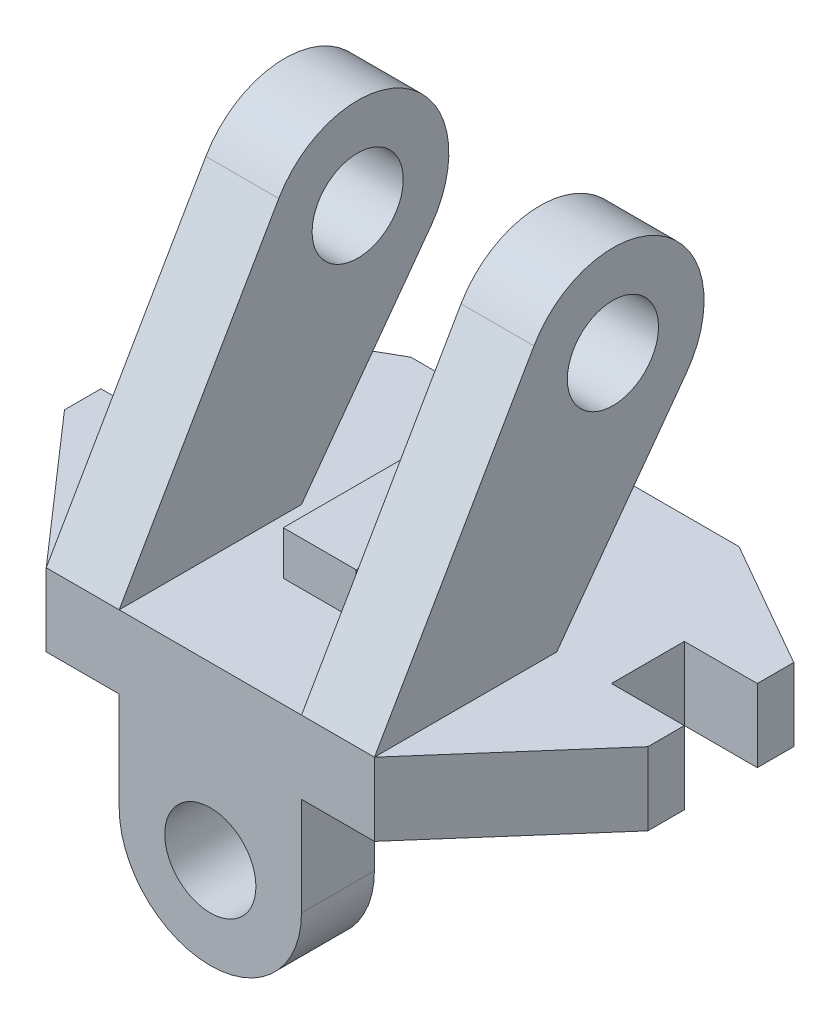
ISO-10303-21;
HEADER;
FILE_DESCRIPTION(('STEP AP214'),'2;1');
FILE_NAME('part.step','',(''),(''),'','','');
FILE_SCHEMA(('AUTOMOTIVE_DESIGN { 1 0 10303 214 1 1 1 1 }'));
ENDSEC;
DATA;
#1=APPLICATION_CONTEXT('core data for automotive mechanical design processes');
#2=APPLICATION_PROTOCOL_DEFINITION('international standard','automotive_design',2000,#1);
#3=PRODUCT_CONTEXT('',#1,'mechanical');
#4=PRODUCT('Part','Part','',(#3));
#5=PRODUCT_RELATED_PRODUCT_CATEGORY('part','',(#4));
#6=PRODUCT_DEFINITION_FORMATION('','',#4);
#7=PRODUCT_DEFINITION_CONTEXT('part definition',#1,'design');
#8=PRODUCT_DEFINITION('design','',#6,#7);
#9=PRODUCT_DEFINITION_SHAPE('','',#8);
#10=(LENGTH_UNIT() NAMED_UNIT(*) SI_UNIT(.MILLI.,.METRE.));
#11=(NAMED_UNIT(*) PLANE_ANGLE_UNIT() SI_UNIT($,.RADIAN.));
#12=(NAMED_UNIT(*) SI_UNIT($,.STERADIAN.) SOLID_ANGLE_UNIT());
#13=UNCERTAINTY_MEASURE_WITH_UNIT(LENGTH_MEASURE(1.E-05),#10,'distance_accuracy_value','');
#14=(GEOMETRIC_REPRESENTATION_CONTEXT(3) GLOBAL_UNCERTAINTY_ASSIGNED_CONTEXT((#13)) GLOBAL_UNIT_ASSIGNED_CONTEXT((#10,
#11,#12)) REPRESENTATION_CONTEXT('',''));
#15=CARTESIAN_POINT('',(0.,0.,0.));
#16=DIRECTION('',(0.,0.,1.));
#17=DIRECTION('',(1.,0.,0.));
#18=AXIS2_PLACEMENT_3D('',#15,#16,#17);
#19=CARTESIAN_POINT('',(0.,20.,-100.));
#20=DIRECTION('',(0.,-1.,0.));
#21=DIRECTION('',(0.,0.,-1.));
#22=AXIS2_PLACEMENT_3D('',#19,#20,#21);
#23=PLANE('',#22);
#24=DIRECTION('',(0.,0.,1.));
#25=VECTOR('',#24,1.);
#26=CARTESIAN_POINT('',(0.,20.,-100.));
#27=LINE('',#26,#25);
#28=CARTESIAN_POINT('',(0.,20.,-50.));
#29=VERTEX_POINT('',#28);
#30=CARTESIAN_POINT('',(0.,20.,-40.));
#31=VERTEX_POINT('',#30);
#32=EDGE_CURVE('E299',#29,#31,#27,.T.);
#33=ORIENTED_EDGE('',*,*,#32,.T.);
#34=DIRECTION('',(0.658504607868518,0.,0.752576694706878));
#35=VECTOR('',#34,1.);
#36=CARTESIAN_POINT('',(-29.7345132743363,20.,-73.9823008849558));
#37=LINE('',#36,#35);
#38=CARTESIAN_POINT('',(35.,20.,0.));
#39=VERTEX_POINT('',#38);
#40=EDGE_CURVE('E362',#31,#39,#37,.T.);
#41=ORIENTED_EDGE('',*,*,#40,.T.);
#42=DIRECTION('',(0.,0.,-1.));
#43=VECTOR('',#42,1.);
#44=CARTESIAN_POINT('',(35.,20.,0.));
#45=LINE('',#44,#43);
#46=CARTESIAN_POINT('',(35.,20.,-50.));
#47=VERTEX_POINT('',#46);
#48=EDGE_CURVE('E474',#39,#47,#45,.T.);
#49=ORIENTED_EDGE('',*,*,#48,.T.);
#50=DIRECTION('',(1.,0.,0.));
#51=VECTOR('',#50,1.);
#52=CARTESIAN_POINT('',(35.,20.,-50.));
#53=LINE('',#52,#51);
#54=CARTESIAN_POINT('',(55.,20.,-50.));
#55=VERTEX_POINT('',#54);
#56=EDGE_CURVE('E499',#47,#55,#53,.T.);
#57=ORIENTED_EDGE('',*,*,#56,.T.);
#58=DIRECTION('',(0.,0.,-1.));
#59=VECTOR('',#58,1.);
#60=CARTESIAN_POINT('',(55.,20.,0.));
#61=LINE('',#60,#59);
#62=CARTESIAN_POINT('',(55.,20.,0.));
#63=VERTEX_POINT('',#62);
#64=EDGE_CURVE('E462',#63,#55,#61,.T.);
#65=ORIENTED_EDGE('',*,*,#64,.F.);
#66=DIRECTION('',(1.,0.,0.));
#67=VECTOR('',#66,1.);
#68=CARTESIAN_POINT('',(0.,20.,0.));
#69=LINE('',#68,#67);
#70=CARTESIAN_POINT('',(105.,20.,0.));
#71=VERTEX_POINT('',#70);
#72=EDGE_CURVE('E274',#63,#71,#69,.T.);
#73=ORIENTED_EDGE('',*,*,#72,.T.);
#74=DIRECTION('',(0.,0.,-1.));
#75=VECTOR('',#74,1.);
#76=CARTESIAN_POINT('',(105.,20.,0.));
#77=LINE('',#76,#75);
#78=CARTESIAN_POINT('',(105.,20.,-50.));
#79=VERTEX_POINT('',#78);
#80=EDGE_CURVE('E410',#71,#79,#77,.T.);
#81=ORIENTED_EDGE('',*,*,#80,.T.);
#82=DIRECTION('',(-1.,0.,0.));
#83=VECTOR('',#82,1.);
#84=CARTESIAN_POINT('',(125.,20.,-50.));
#85=LINE('',#84,#83);
#86=CARTESIAN_POINT('',(125.,20.,-50.));
#87=VERTEX_POINT('',#86);
#88=EDGE_CURVE('E448',#87,#79,#85,.T.);
#89=ORIENTED_EDGE('',*,*,#88,.F.);
#90=DIRECTION('',(0.,0.,-1.));
#91=VECTOR('',#90,1.);
#92=CARTESIAN_POINT('',(125.,20.,0.));
#93=LINE('',#92,#91);
#94=CARTESIAN_POINT('',(125.,20.,0.));
#95=VERTEX_POINT('',#94);
#96=EDGE_CURVE('E422',#95,#87,#93,.T.);
#97=ORIENTED_EDGE('',*,*,#96,.F.);
#98=DIRECTION('',(-0.658504607868518,0.,0.752576694706878));
#99=VECTOR('',#98,1.);
#100=CARTESIAN_POINT('',(120.353982300885,20.,5.30973451327435));
#101=LINE('',#100,#99);
#102=CARTESIAN_POINT('',(160.,20.,-40.));
#103=VERTEX_POINT('',#102);
#104=EDGE_CURVE('E245',#103,#95,#101,.T.);
#105=ORIENTED_EDGE('',*,*,#104,.F.);
#106=DIRECTION('',(0.,0.,1.));
#107=VECTOR('',#106,1.);
#108=CARTESIAN_POINT('',(160.,20.,-100.));
#109=LINE('',#108,#107);
#110=CARTESIAN_POINT('',(160.,20.,-50.));
#111=VERTEX_POINT('',#110);
#112=EDGE_CURVE('E285',#111,#103,#109,.T.);
#113=ORIENTED_EDGE('',*,*,#112,.F.);
#114=DIRECTION('',(1.,0.,0.));
#115=VECTOR('',#114,1.);
#116=CARTESIAN_POINT('',(0.,20.,-50.));
#117=LINE('',#116,#115);
#118=CARTESIAN_POINT('',(140.,20.,-50.));
#119=VERTEX_POINT('',#118);
#120=EDGE_CURVE('E401',#119,#111,#117,.T.);
#121=ORIENTED_EDGE('',*,*,#120,.F.);
#122=DIRECTION('',(0.,0.,1.));
#123=VECTOR('',#122,1.);
#124=CARTESIAN_POINT('',(140.,20.,-100.));
#125=LINE('',#124,#123);
#126=CARTESIAN_POINT('',(140.,20.,-70.));
#127=VERTEX_POINT('',#126);
#128=EDGE_CURVE('E334',#127,#119,#125,.T.);
#129=ORIENTED_EDGE('',*,*,#128,.F.);
#130=DIRECTION('',(-1.,0.,0.));
#131=VECTOR('',#130,1.);
#132=CARTESIAN_POINT('',(0.,20.,-70.));
#133=LINE('',#132,#131);
#134=CARTESIAN_POINT('',(160.,20.,-70.));
#135=VERTEX_POINT('',#134);
#136=EDGE_CURVE('E396',#135,#127,#133,.T.);
#137=ORIENTED_EDGE('',*,*,#136,.F.);
#138=CARTESIAN_POINT('',(160.,20.,-80.));
#139=VERTEX_POINT('',#138);
#140=EDGE_CURVE('E289',#139,#135,#109,.T.);
#141=ORIENTED_EDGE('',*,*,#140,.F.);
#142=DIRECTION('',(0.868243142124459,0.,0.496138938356834));
#143=VECTOR('',#142,1.);
#144=CARTESIAN_POINT('',(30.7692307692308,20.,-153.846153846154));
#145=LINE('',#144,#143);
#146=CARTESIAN_POINT('',(125.,20.,-100.));
#147=VERTEX_POINT('',#146);
#148=EDGE_CURVE('E377',#147,#139,#145,.T.);
#149=ORIENTED_EDGE('',*,*,#148,.F.);
#150=DIRECTION('',(1.,0.,0.));
#151=VECTOR('',#150,1.);
#152=CARTESIAN_POINT('',(0.,20.,-100.));
#153=LINE('',#152,#151);
#154=CARTESIAN_POINT('',(90.,20.,-100.));
#155=VERTEX_POINT('',#154);
#156=EDGE_CURVE('E279',#155,#147,#153,.T.);
#157=ORIENTED_EDGE('',*,*,#156,.F.);
#158=DIRECTION('',(0.,0.,-1.));
#159=VECTOR('',#158,1.);
#160=CARTESIAN_POINT('',(90.,20.,-30.));
#161=LINE('',#160,#159);
#162=CARTESIAN_POINT('',(90.,20.,-30.));
#163=VERTEX_POINT('',#162);
#164=EDGE_CURVE('E545',#163,#155,#161,.T.);
#165=ORIENTED_EDGE('',*,*,#164,.F.);
#166=DIRECTION('',(1.,0.,0.));
#167=VECTOR('',#166,1.);
#168=CARTESIAN_POINT('',(0.,20.,-30.));
#169=LINE('',#168,#167);
#170=CARTESIAN_POINT('',(70.,20.,-30.));
#171=VERTEX_POINT('',#170);
#172=EDGE_CURVE('E510',#171,#163,#169,.T.);
#173=ORIENTED_EDGE('',*,*,#172,.F.);
#174=DIRECTION('',(0.,0.,-1.));
#175=VECTOR('',#174,1.);
#176=CARTESIAN_POINT('',(70.,20.,-30.));
#177=LINE('',#176,#175);
#178=CARTESIAN_POINT('',(70.,20.,-100.));
#179=VERTEX_POINT('',#178);
#180=EDGE_CURVE('E525',#171,#179,#177,.T.);
#181=ORIENTED_EDGE('',*,*,#180,.T.);
#182=CARTESIAN_POINT('',(35.,20.,-100.));
#183=VERTEX_POINT('',#182);
#184=EDGE_CURVE('E592',#183,#179,#153,.T.);
#185=ORIENTED_EDGE('',*,*,#184,.F.);
#186=DIRECTION('',(-0.868243142124459,0.,0.496138938356834));
#187=VECTOR('',#186,1.);
#188=CARTESIAN_POINT('',(8.61538461538461,20.,-84.9230769230769));
#189=LINE('',#188,#187);
#190=CARTESIAN_POINT('',(0.,20.,-80.));
#191=VERTEX_POINT('',#190);
#192=EDGE_CURVE('E369',#183,#191,#189,.T.);
#193=ORIENTED_EDGE('',*,*,#192,.T.);
#194=CARTESIAN_POINT('',(0.,20.,-70.));
#195=VERTEX_POINT('',#194);
#196=EDGE_CURVE('E298',#191,#195,#27,.T.);
#197=ORIENTED_EDGE('',*,*,#196,.T.);
#198=DIRECTION('',(1.,0.,0.));
#199=VECTOR('',#198,1.);
#200=CARTESIAN_POINT('',(0.,20.,-70.));
#201=LINE('',#200,#199);
#202=CARTESIAN_POINT('',(20.,20.,-70.));
#203=VERTEX_POINT('',#202);
#204=EDGE_CURVE('E59',#195,#203,#201,.T.);
#205=ORIENTED_EDGE('',*,*,#204,.T.);
#206=DIRECTION('',(0.,0.,1.));
#207=VECTOR('',#206,1.);
#208=CARTESIAN_POINT('',(20.,20.,-100.));
#209=LINE('',#208,#207);
#210=CARTESIAN_POINT('',(20.,20.,-50.));
#211=VERTEX_POINT('',#210);
#212=EDGE_CURVE('E392',#203,#211,#209,.T.);
#213=ORIENTED_EDGE('',*,*,#212,.T.);
#214=DIRECTION('',(-1.,0.,0.));
#215=VECTOR('',#214,1.);
#216=CARTESIAN_POINT('',(0.,20.,-50.));
#217=LINE('',#216,#215);
#218=EDGE_CURVE('E388',#211,#29,#217,.T.);
#219=ORIENTED_EDGE('',*,*,#218,.T.);
#220=EDGE_LOOP('',(#33,#41,#49,#57,#65,#73,#81,#89,#97,#105,#113,#121,#129,#137,#141,#149,#157,
#165,#173,#181,#185,#193,#197,#205,#213,#219));
#221=FACE_BOUND('',#220,.T.);
#222=ADVANCED_FACE('F36',(#221),#23,.F.);
#223=CARTESIAN_POINT('',(160.,0.,-100.));
#224=DIRECTION('',(1.,0.,0.));
#225=DIRECTION('',(0.,0.,-1.));
#226=AXIS2_PLACEMENT_3D('',#223,#224,#225);
#227=PLANE('',#226);
#228=ORIENTED_EDGE('',*,*,#112,.T.);
#229=DIRECTION('',(0.,1.,0.));
#230=VECTOR('',#229,1.);
#231=CARTESIAN_POINT('',(160.,-52.,-40.));
#232=LINE('',#231,#230);
#233=CARTESIAN_POINT('',(160.,0.,-40.));
#234=VERTEX_POINT('',#233);
#235=EDGE_CURVE('E250',#234,#103,#232,.T.);
#236=ORIENTED_EDGE('',*,*,#235,.F.);
#237=DIRECTION('',(0.,0.,1.));
#238=VECTOR('',#237,1.);
#239=CARTESIAN_POINT('',(160.,0.,-100.));
#240=LINE('',#239,#238);
#241=CARTESIAN_POINT('',(160.,0.,-50.));
#242=VERTEX_POINT('',#241);
#243=EDGE_CURVE('E261',#242,#234,#240,.T.);
#244=ORIENTED_EDGE('',*,*,#243,.F.);
#245=DIRECTION('',(0.,1.,0.));
#246=VECTOR('',#245,1.);
#247=CARTESIAN_POINT('',(160.,-52.,-50.));
#248=LINE('',#247,#246);
#249=EDGE_CURVE('E349',#242,#111,#248,.T.);
#250=ORIENTED_EDGE('',*,*,#249,.T.);
#251=EDGE_LOOP('',(#228,#236,#244,#250));
#252=FACE_BOUND('',#251,.T.);
#253=ADVANCED_FACE('F665',(#252),#227,.T.);
#254=CARTESIAN_POINT('',(160.,0.,-80.));
#255=VERTEX_POINT('',#254);
#256=CARTESIAN_POINT('',(160.,0.,-70.));
#257=VERTEX_POINT('',#256);
#258=EDGE_CURVE('E290',#255,#257,#240,.T.);
#259=ORIENTED_EDGE('',*,*,#258,.F.);
#260=DIRECTION('',(0.,1.,0.));
#261=VECTOR('',#260,1.);
#262=CARTESIAN_POINT('',(160.,-52.,-80.));
#263=LINE('',#262,#261);
#264=EDGE_CURVE('E251',#255,#139,#263,.T.);
#265=ORIENTED_EDGE('',*,*,#264,.T.);
#266=ORIENTED_EDGE('',*,*,#140,.T.);
#267=DIRECTION('',(0.,1.,0.));
#268=VECTOR('',#267,1.);
#269=CARTESIAN_POINT('',(160.,-52.,-70.));
#270=LINE('',#269,#268);
#271=EDGE_CURVE('E344',#257,#135,#270,.T.);
#272=ORIENTED_EDGE('',*,*,#271,.F.);
#273=EDGE_LOOP('',(#259,#265,#266,#272));
#274=FACE_BOUND('',#273,.T.);
#275=ADVANCED_FACE('F682',(#274),#227,.T.);
#276=CARTESIAN_POINT('',(0.,0.,-100.));
#277=DIRECTION('',(0.,-1.,0.));
#278=DIRECTION('',(0.,0.,-1.));
#279=AXIS2_PLACEMENT_3D('',#276,#277,#278);
#280=PLANE('',#279);
#281=DIRECTION('',(0.658504607868518,0.,0.752576694706878));
#282=VECTOR('',#281,1.);
#283=CARTESIAN_POINT('',(-29.7345132743363,0.,-73.9823008849558));
#284=LINE('',#283,#282);
#285=CARTESIAN_POINT('',(0.,0.,-40.));
#286=VERTEX_POINT('',#285);
#287=CARTESIAN_POINT('',(35.,0.,0.));
#288=VERTEX_POINT('',#287);
#289=EDGE_CURVE('E359',#286,#288,#284,.T.);
#290=ORIENTED_EDGE('',*,*,#289,.F.);
#291=DIRECTION('',(0.,0.,1.));
#292=VECTOR('',#291,1.);
#293=CARTESIAN_POINT('',(0.,0.,-100.));
#294=LINE('',#293,#292);
#295=CARTESIAN_POINT('',(0.,0.,-50.));
#296=VERTEX_POINT('',#295);
#297=EDGE_CURVE('E294',#296,#286,#294,.T.);
#298=ORIENTED_EDGE('',*,*,#297,.F.);
#299=DIRECTION('',(-1.,0.,0.));
#300=VECTOR('',#299,1.);
#301=CARTESIAN_POINT('',(0.,0.,-50.));
#302=LINE('',#301,#300);
#303=CARTESIAN_POINT('',(20.,0.,-50.));
#304=VERTEX_POINT('',#303);
#305=EDGE_CURVE('E385',#304,#296,#302,.T.);
#306=ORIENTED_EDGE('',*,*,#305,.F.);
#307=DIRECTION('',(0.,0.,1.));
#308=VECTOR('',#307,1.);
#309=CARTESIAN_POINT('',(20.,0.,-100.));
#310=LINE('',#309,#308);
#311=CARTESIAN_POINT('',(20.,0.,-70.));
#312=VERTEX_POINT('',#311);
#313=EDGE_CURVE('E318',#312,#304,#310,.T.);
#314=ORIENTED_EDGE('',*,*,#313,.F.);
#315=DIRECTION('',(1.,0.,0.));
#316=VECTOR('',#315,1.);
#317=CARTESIAN_POINT('',(0.,0.,-70.));
#318=LINE('',#317,#316);
#319=CARTESIAN_POINT('',(0.,0.,-70.));
#320=VERTEX_POINT('',#319);
#321=EDGE_CURVE('E380',#320,#312,#318,.T.);
#322=ORIENTED_EDGE('',*,*,#321,.F.);
#323=CARTESIAN_POINT('',(0.,0.,-80.));
#324=VERTEX_POINT('',#323);
#325=EDGE_CURVE('E293',#324,#320,#294,.T.);
#326=ORIENTED_EDGE('',*,*,#325,.F.);
#327=DIRECTION('',(-0.868243142124459,0.,0.496138938356834));
#328=VECTOR('',#327,1.);
#329=CARTESIAN_POINT('',(8.61538461538461,0.,-84.9230769230769));
#330=LINE('',#329,#328);
#331=CARTESIAN_POINT('',(35.,0.,-100.));
#332=VERTEX_POINT('',#331);
#333=EDGE_CURVE('E366',#332,#324,#330,.T.);
#334=ORIENTED_EDGE('',*,*,#333,.F.);
#335=DIRECTION('',(1.,0.,0.));
#336=VECTOR('',#335,1.);
#337=CARTESIAN_POINT('',(0.,0.,-100.));
#338=LINE('',#337,#336);
#339=CARTESIAN_POINT('',(125.,0.,-100.));
#340=VERTEX_POINT('',#339);
#341=EDGE_CURVE('E303',#332,#340,#338,.T.);
#342=ORIENTED_EDGE('',*,*,#341,.T.);
#343=DIRECTION('',(0.868243142124459,0.,0.496138938356834));
#344=VECTOR('',#343,1.);
#345=CARTESIAN_POINT('',(30.7692307692308,0.,-153.846153846154));
#346=LINE('',#345,#344);
#347=EDGE_CURVE('E373',#340,#255,#346,.T.);
#348=ORIENTED_EDGE('',*,*,#347,.T.);
#349=ORIENTED_EDGE('',*,*,#258,.T.);
#350=DIRECTION('',(-1.,0.,0.));
#351=VECTOR('',#350,1.);
#352=CARTESIAN_POINT('',(0.,0.,-70.));
#353=LINE('',#352,#351);
#354=CARTESIAN_POINT('',(140.,0.,-70.));
#355=VERTEX_POINT('',#354);
#356=EDGE_CURVE('E321',#257,#355,#353,.T.);
#357=ORIENTED_EDGE('',*,*,#356,.T.);
#358=DIRECTION('',(0.,0.,1.));
#359=VECTOR('',#358,1.);
#360=CARTESIAN_POINT('',(140.,0.,-100.));
#361=LINE('',#360,#359);
#362=CARTESIAN_POINT('',(140.,0.,-50.));
#363=VERTEX_POINT('',#362);
#364=EDGE_CURVE('E44',#355,#363,#361,.T.);
#365=ORIENTED_EDGE('',*,*,#364,.T.);
#366=DIRECTION('',(1.,0.,0.));
#367=VECTOR('',#366,1.);
#368=CARTESIAN_POINT('',(0.,0.,-50.));
#369=LINE('',#368,#367);
#370=EDGE_CURVE('E11',#363,#242,#369,.T.);
#371=ORIENTED_EDGE('',*,*,#370,.T.);
#372=ORIENTED_EDGE('',*,*,#243,.T.);
#373=DIRECTION('',(-0.658504607868518,0.,0.752576694706878));
#374=VECTOR('',#373,1.);
#375=CARTESIAN_POINT('',(120.353982300885,0.,5.30973451327435));
#376=LINE('',#375,#374);
#377=CARTESIAN_POINT('',(125.,0.,0.));
#378=VERTEX_POINT('',#377);
#379=EDGE_CURVE('E242',#234,#378,#376,.T.);
#380=ORIENTED_EDGE('',*,*,#379,.T.);
#381=DIRECTION('',(1.,0.,0.));
#382=VECTOR('',#381,1.);
#383=CARTESIAN_POINT('',(0.,0.,0.));
#384=LINE('',#383,#382);
#385=CARTESIAN_POINT('',(105.,0.,0.));
#386=VERTEX_POINT('',#385);
#387=EDGE_CURVE('E259',#386,#378,#384,.T.);
#388=ORIENTED_EDGE('',*,*,#387,.F.);
#389=DIRECTION('',(0.,0.,1.));
#390=VECTOR('',#389,1.);
#391=CARTESIAN_POINT('',(105.,0.,-20.));
#392=LINE('',#391,#390);
#393=CARTESIAN_POINT('',(105.,0.,-20.));
#394=VERTEX_POINT('',#393);
#395=EDGE_CURVE('E584',#394,#386,#392,.T.);
#396=ORIENTED_EDGE('',*,*,#395,.F.);
#397=DIRECTION('',(1.,0.,0.));
#398=VECTOR('',#397,1.);
#399=CARTESIAN_POINT('',(0.,0.,-20.));
#400=LINE('',#399,#398);
#401=CARTESIAN_POINT('',(55.,0.,-20.));
#402=VERTEX_POINT('',#401);
#403=EDGE_CURVE('E564',#402,#394,#400,.T.);
#404=ORIENTED_EDGE('',*,*,#403,.F.);
#405=DIRECTION('',(0.,0.,1.));
#406=VECTOR('',#405,1.);
#407=CARTESIAN_POINT('',(55.,0.,-20.));
#408=LINE('',#407,#406);
#409=CARTESIAN_POINT('',(55.,0.,0.));
#410=VERTEX_POINT('',#409);
#411=EDGE_CURVE('E281',#402,#410,#408,.T.);
#412=ORIENTED_EDGE('',*,*,#411,.T.);
#413=EDGE_CURVE('E273',#288,#410,#384,.T.);
#414=ORIENTED_EDGE('',*,*,#413,.F.);
#415=EDGE_LOOP('',(#290,#298,#306,#314,#322,#326,#334,#342,#348,#349,#357,#365,#371,#372,#380,
#388,#396,#404,#412,#414));
#416=FACE_BOUND('',#415,.T.);
#417=ADVANCED_FACE('F257',(#416),#280,.T.);
#418=CARTESIAN_POINT('',(0.,0.,-100.));
#419=DIRECTION('',(1.,0.,0.));
#420=DIRECTION('',(0.,0.,-1.));
#421=AXIS2_PLACEMENT_3D('',#418,#419,#420);
#422=PLANE('',#421);
#423=ORIENTED_EDGE('',*,*,#297,.T.);
#424=DIRECTION('',(0.,1.,0.));
#425=VECTOR('',#424,1.);
#426=CARTESIAN_POINT('',(0.,-52.,-40.));
#427=LINE('',#426,#425);
#428=EDGE_CURVE('E355',#286,#31,#427,.T.);
#429=ORIENTED_EDGE('',*,*,#428,.T.);
#430=ORIENTED_EDGE('',*,*,#32,.F.);
#431=DIRECTION('',(0.,-1.,0.));
#432=VECTOR('',#431,1.);
#433=CARTESIAN_POINT('',(0.,0.,-50.));
#434=LINE('',#433,#432);
#435=EDGE_CURVE('E314',#29,#296,#434,.T.);
#436=ORIENTED_EDGE('',*,*,#435,.T.);
#437=EDGE_LOOP('',(#423,#429,#430,#436));
#438=FACE_BOUND('',#437,.T.);
#439=ADVANCED_FACE('F691',(#438),#422,.F.);
#440=CARTESIAN_POINT('',(0.,0.,-100.));
#441=DIRECTION('',(0.,0.,1.));
#442=DIRECTION('',(1.,0.,0.));
#443=AXIS2_PLACEMENT_3D('',#440,#441,#442);
#444=PLANE('',#443);
#445=DIRECTION('',(0.,1.,0.));
#446=VECTOR('',#445,1.);
#447=CARTESIAN_POINT('',(125.,0.,-100.));
#448=LINE('',#447,#446);
#449=EDGE_CURVE('E308',#340,#147,#448,.T.);
#450=ORIENTED_EDGE('',*,*,#449,.F.);
#451=ORIENTED_EDGE('',*,*,#341,.F.);
#452=DIRECTION('',(0.,1.,0.));
#453=VECTOR('',#452,1.);
#454=CARTESIAN_POINT('',(35.,0.,-100.));
#455=LINE('',#454,#453);
#456=EDGE_CURVE('E304',#332,#183,#455,.T.);
#457=ORIENTED_EDGE('',*,*,#456,.T.);
#458=ORIENTED_EDGE('',*,*,#184,.T.);
#459=DIRECTION('',(0.,-1.,0.));
#460=VECTOR('',#459,1.);
#461=CARTESIAN_POINT('',(70.,0.,-100.));
#462=LINE('',#461,#460);
#463=CARTESIAN_POINT('',(70.,32.,-100.));
#464=VERTEX_POINT('',#463);
#465=EDGE_CURVE('E514',#464,#179,#462,.T.);
#466=ORIENTED_EDGE('',*,*,#465,.F.);
#467=DIRECTION('',(1.,0.,0.));
#468=VECTOR('',#467,1.);
#469=CARTESIAN_POINT('',(0.,32.,-100.));
#470=LINE('',#469,#468);
#471=CARTESIAN_POINT('',(90.,32.,-100.));
#472=VERTEX_POINT('',#471);
#473=EDGE_CURVE('E529',#464,#472,#470,.T.);
#474=ORIENTED_EDGE('',*,*,#473,.T.);
#475=DIRECTION('',(0.,-1.,0.));
#476=VECTOR('',#475,1.);
#477=CARTESIAN_POINT('',(90.,-1.04083408558608E-13,-100.));
#478=LINE('',#477,#476);
#479=EDGE_CURVE('E509',#472,#155,#478,.T.);
#480=ORIENTED_EDGE('',*,*,#479,.T.);
#481=ORIENTED_EDGE('',*,*,#156,.T.);
#482=EDGE_LOOP('',(#450,#451,#457,#458,#466,#474,#480,#481));
#483=FACE_BOUND('',#482,.T.);
#484=ADVANCED_FACE('F603',(#483),#444,.F.);
#485=CARTESIAN_POINT('',(0.,0.,0.));
#486=DIRECTION('',(0.,0.,1.));
#487=DIRECTION('',(1.,0.,0.));
#488=AXIS2_PLACEMENT_3D('',#485,#486,#487);
#489=PLANE('',#488);
#490=DIRECTION('',(0.,1.,0.));
#491=VECTOR('',#490,1.);
#492=CARTESIAN_POINT('',(35.,-52.,0.));
#493=LINE('',#492,#491);
#494=EDGE_CURVE('E658',#288,#39,#493,.T.);
#495=ORIENTED_EDGE('',*,*,#494,.F.);
#496=ORIENTED_EDGE('',*,*,#413,.T.);
#497=DIRECTION('',(0.,-1.,0.));
#498=VECTOR('',#497,1.);
#499=CARTESIAN_POINT('',(55.,0.,0.));
#500=LINE('',#499,#498);
#501=CARTESIAN_POINT('',(55.,-27.,0.));
#502=VERTEX_POINT('',#501);
#503=EDGE_CURVE('E572',#410,#502,#500,.T.);
#504=ORIENTED_EDGE('',*,*,#503,.T.);
#505=CARTESIAN_POINT('',(80.,-27.,0.));
#506=DIRECTION('',(0.,0.,1.));
#507=DIRECTION('',(1.,0.,0.));
#508=AXIS2_PLACEMENT_3D('',#505,#506,#507);
#509=CIRCLE('',#508,25.);
#510=CARTESIAN_POINT('',(105.,-27.,0.));
#511=VERTEX_POINT('',#510);
#512=EDGE_CURVE('E576',#502,#511,#509,.T.);
#513=ORIENTED_EDGE('',*,*,#512,.T.);
#514=DIRECTION('',(0.,-1.,0.));
#515=VECTOR('',#514,1.);
#516=CARTESIAN_POINT('',(105.,0.,0.));
#517=LINE('',#516,#515);
#518=EDGE_CURVE('E270',#386,#511,#517,.T.);
#519=ORIENTED_EDGE('',*,*,#518,.F.);
#520=ORIENTED_EDGE('',*,*,#387,.T.);
#521=DIRECTION('',(0.,1.,0.));
#522=VECTOR('',#521,1.);
#523=CARTESIAN_POINT('',(125.,-52.,0.));
#524=LINE('',#523,#522);
#525=EDGE_CURVE('E239',#378,#95,#524,.T.);
#526=ORIENTED_EDGE('',*,*,#525,.T.);
#527=DIRECTION('',(-1.,0.,0.));
#528=VECTOR('',#527,1.);
#529=CARTESIAN_POINT('',(125.,20.,0.));
#530=LINE('',#529,#528);
#531=EDGE_CURVE('E444',#95,#71,#530,.T.);
#532=ORIENTED_EDGE('',*,*,#531,.T.);
#533=ORIENTED_EDGE('',*,*,#72,.F.);
#534=DIRECTION('',(1.,0.,0.));
#535=VECTOR('',#534,1.);
#536=CARTESIAN_POINT('',(35.,20.,0.));
#537=LINE('',#536,#535);
#538=EDGE_CURVE('E477',#39,#63,#537,.T.);
#539=ORIENTED_EDGE('',*,*,#538,.F.);
#540=EDGE_LOOP('',(#495,#496,#504,#513,#519,#520,#526,#532,#533,#539));
#541=FACE_BOUND('',#540,.T.);
#542=CARTESIAN_POINT('',(80.,-27.,0.));
#543=DIRECTION('',(0.,0.,1.));
#544=DIRECTION('',(1.,0.,0.));
#545=AXIS2_PLACEMENT_3D('',#542,#543,#544);
#546=CIRCLE('',#545,12.5);
#547=CARTESIAN_POINT('',(92.5,-27.,0.));
#548=VERTEX_POINT('',#547);
#549=EDGE_CURVE('E548',#548,#548,#546,.T.);
#550=ORIENTED_EDGE('',*,*,#549,.F.);
#551=EDGE_LOOP('',(#550));
#552=FACE_BOUND('',#551,.T.);
#553=ADVANCED_FACE('F266',(#541,#552),#489,.T.);
#554=ORIENTED_EDGE('',*,*,#325,.T.);
#555=DIRECTION('',(0.,1.,0.));
#556=VECTOR('',#555,1.);
#557=CARTESIAN_POINT('',(0.,0.,-70.));
#558=LINE('',#557,#556);
#559=EDGE_CURVE('E311',#320,#195,#558,.T.);
#560=ORIENTED_EDGE('',*,*,#559,.T.);
#561=ORIENTED_EDGE('',*,*,#196,.F.);
#562=DIRECTION('',(0.,1.,0.));
#563=VECTOR('',#562,1.);
#564=CARTESIAN_POINT('',(0.,-52.,-80.));
#565=LINE('',#564,#563);
#566=EDGE_CURVE('E263',#324,#191,#565,.T.);
#567=ORIENTED_EDGE('',*,*,#566,.F.);
#568=EDGE_LOOP('',(#554,#560,#561,#567));
#569=FACE_BOUND('',#568,.T.);
#570=ADVANCED_FACE('F635',(#569),#422,.F.);
#571=CARTESIAN_POINT('',(55.,0.,-20.));
#572=DIRECTION('',(-1.,0.,0.));
#573=DIRECTION('',(0.,-1.,0.));
#574=AXIS2_PLACEMENT_3D('',#571,#572,#573);
#575=PLANE('',#574);
#576=ORIENTED_EDGE('',*,*,#503,.F.);
#577=ORIENTED_EDGE('',*,*,#411,.F.);
#578=DIRECTION('',(0.,-1.,0.));
#579=VECTOR('',#578,1.);
#580=CARTESIAN_POINT('',(55.,0.,-20.));
#581=LINE('',#580,#579);
#582=CARTESIAN_POINT('',(55.,-27.,-20.));
#583=VERTEX_POINT('',#582);
#584=EDGE_CURVE('E553',#402,#583,#581,.T.);
#585=ORIENTED_EDGE('',*,*,#584,.T.);
#586=DIRECTION('',(0.,0.,1.));
#587=VECTOR('',#586,1.);
#588=CARTESIAN_POINT('',(55.,-27.,-20.));
#589=LINE('',#588,#587);
#590=EDGE_CURVE('E568',#583,#502,#589,.T.);
#591=ORIENTED_EDGE('',*,*,#590,.T.);
#592=EDGE_LOOP('',(#576,#577,#585,#591));
#593=FACE_BOUND('',#592,.T.);
#594=ADVANCED_FACE('F693',(#593),#575,.T.);
#595=CARTESIAN_POINT('',(105.,0.,-20.));
#596=DIRECTION('',(-1.,0.,0.));
#597=DIRECTION('',(0.,0.,1.));
#598=AXIS2_PLACEMENT_3D('',#595,#596,#597);
#599=PLANE('',#598);
#600=ORIENTED_EDGE('',*,*,#518,.T.);
#601=DIRECTION('',(0.,0.,1.));
#602=VECTOR('',#601,1.);
#603=CARTESIAN_POINT('',(105.,-27.,-20.));
#604=LINE('',#603,#602);
#605=CARTESIAN_POINT('',(105.,-27.,-20.));
#606=VERTEX_POINT('',#605);
#607=EDGE_CURVE('E587',#606,#511,#604,.T.);
#608=ORIENTED_EDGE('',*,*,#607,.F.);
#609=DIRECTION('',(0.,-1.,0.));
#610=VECTOR('',#609,1.);
#611=CARTESIAN_POINT('',(105.,0.,-20.));
#612=LINE('',#611,#610);
#613=EDGE_CURVE('E561',#394,#606,#612,.T.);
#614=ORIENTED_EDGE('',*,*,#613,.F.);
#615=ORIENTED_EDGE('',*,*,#395,.T.);
#616=EDGE_LOOP('',(#600,#608,#614,#615));
#617=FACE_BOUND('',#616,.T.);
#618=ADVANCED_FACE('F698',(#617),#599,.F.);
#619=CARTESIAN_POINT('',(80.,-27.,-20.));
#620=DIRECTION('',(0.,0.,1.));
#621=DIRECTION('',(1.,0.,0.));
#622=AXIS2_PLACEMENT_3D('',#619,#620,#621);
#623=CYLINDRICAL_SURFACE('',#622,12.5);
#624=CARTESIAN_POINT('',(80.,-27.,-20.));
#625=DIRECTION('',(0.,0.,1.));
#626=DIRECTION('',(1.,0.,0.));
#627=AXIS2_PLACEMENT_3D('',#624,#625,#626);
#628=CIRCLE('',#627,12.5);
#629=CARTESIAN_POINT('',(92.5,-27.,-20.));
#630=VERTEX_POINT('',#629);
#631=EDGE_CURVE('E549',#630,#630,#628,.T.);
#632=ORIENTED_EDGE('',*,*,#631,.F.);
#633=EDGE_LOOP('',(#632));
#634=FACE_BOUND('',#633,.T.);
#635=ORIENTED_EDGE('',*,*,#549,.T.);
#636=EDGE_LOOP('',(#635));
#637=FACE_BOUND('',#636,.T.);
#638=ADVANCED_FACE('F767',(#634,#637),#623,.F.);
#639=CARTESIAN_POINT('',(80.,-27.,-20.));
#640=DIRECTION('',(0.,0.,1.));
#641=DIRECTION('',(1.,0.,0.));
#642=AXIS2_PLACEMENT_3D('',#639,#640,#641);
#643=CYLINDRICAL_SURFACE('',#642,25.);
#644=ORIENTED_EDGE('',*,*,#512,.F.);
#645=ORIENTED_EDGE('',*,*,#590,.F.);
#646=CARTESIAN_POINT('',(80.,-27.,-20.));
#647=DIRECTION('',(0.,0.,1.));
#648=DIRECTION('',(1.,0.,0.));
#649=AXIS2_PLACEMENT_3D('',#646,#647,#648);
#650=CIRCLE('',#649,25.);
#651=EDGE_CURVE('E557',#583,#606,#650,.T.);
#652=ORIENTED_EDGE('',*,*,#651,.T.);
#653=ORIENTED_EDGE('',*,*,#607,.T.);
#654=EDGE_LOOP('',(#644,#645,#652,#653));
#655=FACE_BOUND('',#654,.T.);
#656=ADVANCED_FACE('F763',(#655),#643,.T.);
#657=CARTESIAN_POINT('',(0.,0.,-20.));
#658=DIRECTION('',(0.,0.,1.));
#659=DIRECTION('',(1.,0.,0.));
#660=AXIS2_PLACEMENT_3D('',#657,#658,#659);
#661=PLANE('',#660);
#662=ORIENTED_EDGE('',*,*,#631,.T.);
#663=EDGE_LOOP('',(#662));
#664=FACE_BOUND('',#663,.T.);
#665=ORIENTED_EDGE('',*,*,#584,.F.);
#666=ORIENTED_EDGE('',*,*,#403,.T.);
#667=ORIENTED_EDGE('',*,*,#613,.T.);
#668=ORIENTED_EDGE('',*,*,#651,.F.);
#669=EDGE_LOOP('',(#665,#666,#667,#668));
#670=FACE_BOUND('',#669,.T.);
#671=ADVANCED_FACE('F759',(#664,#670),#661,.F.);
#672=CARTESIAN_POINT('',(90.,-1.04083408558608E-13,-30.));
#673=DIRECTION('',(1.,0.,0.));
#674=DIRECTION('',(0.,1.,0.));
#675=AXIS2_PLACEMENT_3D('',#672,#673,#674);
#676=PLANE('',#675);
#677=ORIENTED_EDGE('',*,*,#479,.F.);
#678=DIRECTION('',(0.,0.,-1.));
#679=VECTOR('',#678,1.);
#680=CARTESIAN_POINT('',(90.,32.,-30.));
#681=LINE('',#680,#679);
#682=CARTESIAN_POINT('',(90.,32.,-30.));
#683=VERTEX_POINT('',#682);
#684=EDGE_CURVE('E542',#683,#472,#681,.T.);
#685=ORIENTED_EDGE('',*,*,#684,.F.);
#686=DIRECTION('',(0.,-1.,0.));
#687=VECTOR('',#686,1.);
#688=CARTESIAN_POINT('',(90.,-1.04083408558608E-13,-30.));
#689=LINE('',#688,#687);
#690=EDGE_CURVE('E513',#683,#163,#689,.T.);
#691=ORIENTED_EDGE('',*,*,#690,.T.);
#692=ORIENTED_EDGE('',*,*,#164,.T.);
#693=EDGE_LOOP('',(#677,#685,#691,#692));
#694=FACE_BOUND('',#693,.T.);
#695=ADVANCED_FACE('F755',(#694),#676,.T.);
#696=CARTESIAN_POINT('',(0.,32.,-30.));
#697=DIRECTION('',(0.,1.,0.));
#698=DIRECTION('',(0.,0.,1.));
#699=AXIS2_PLACEMENT_3D('',#696,#697,#698);
#700=PLANE('',#699);
#701=ORIENTED_EDGE('',*,*,#473,.F.);
#702=DIRECTION('',(0.,0.,-1.));
#703=VECTOR('',#702,1.);
#704=CARTESIAN_POINT('',(70.,32.,-30.));
#705=LINE('',#704,#703);
#706=CARTESIAN_POINT('',(70.,32.,-30.));
#707=VERTEX_POINT('',#706);
#708=EDGE_CURVE('E539',#707,#464,#705,.T.);
#709=ORIENTED_EDGE('',*,*,#708,.F.);
#710=DIRECTION('',(1.,0.,0.));
#711=VECTOR('',#710,1.);
#712=CARTESIAN_POINT('',(0.,32.,-30.));
#713=LINE('',#712,#711);
#714=EDGE_CURVE('E518',#707,#683,#713,.T.);
#715=ORIENTED_EDGE('',*,*,#714,.T.);
#716=ORIENTED_EDGE('',*,*,#684,.T.);
#717=EDGE_LOOP('',(#701,#709,#715,#716));
#718=FACE_BOUND('',#717,.T.);
#719=ADVANCED_FACE('F751',(#718),#700,.T.);
#720=CARTESIAN_POINT('',(70.,0.,-30.));
#721=DIRECTION('',(1.,0.,0.));
#722=DIRECTION('',(0.,0.,-1.));
#723=AXIS2_PLACEMENT_3D('',#720,#721,#722);
#724=PLANE('',#723);
#725=ORIENTED_EDGE('',*,*,#465,.T.);
#726=ORIENTED_EDGE('',*,*,#180,.F.);
#727=DIRECTION('',(0.,-1.,0.));
#728=VECTOR('',#727,1.);
#729=CARTESIAN_POINT('',(70.,0.,-30.));
#730=LINE('',#729,#728);
#731=EDGE_CURVE('E522',#707,#171,#730,.T.);
#732=ORIENTED_EDGE('',*,*,#731,.F.);
#733=ORIENTED_EDGE('',*,*,#708,.T.);
#734=EDGE_LOOP('',(#725,#726,#732,#733));
#735=FACE_BOUND('',#734,.T.);
#736=ADVANCED_FACE('F747',(#735),#724,.F.);
#737=CARTESIAN_POINT('',(0.,0.,-30.));
#738=DIRECTION('',(0.,0.,-1.));
#739=DIRECTION('',(-1.,0.,0.));
#740=AXIS2_PLACEMENT_3D('',#737,#738,#739);
#741=PLANE('',#740);
#742=ORIENTED_EDGE('',*,*,#172,.T.);
#743=ORIENTED_EDGE('',*,*,#690,.F.);
#744=ORIENTED_EDGE('',*,*,#714,.F.);
#745=ORIENTED_EDGE('',*,*,#731,.T.);
#746=EDGE_LOOP('',(#742,#743,#744,#745));
#747=FACE_BOUND('',#746,.T.);
#748=ADVANCED_FACE('F738',(#747),#741,.F.);
#749=CARTESIAN_POINT('',(35.,5.00000000000008,8.66025403784442));
#750=DIRECTION('',(0.,0.500000000000004,0.866025403784436));
#751=DIRECTION('',(0.,-0.866025403784436,0.500000000000004));
#752=AXIS2_PLACEMENT_3D('',#749,#750,#751);
#753=PLANE('',#752);
#754=DIRECTION('',(0.,-0.866025403784436,0.500000000000004));
#755=VECTOR('',#754,1.);
#756=CARTESIAN_POINT('',(55.,5.00000000000008,8.66025403784442));
#757=LINE('',#756,#755);
#758=CARTESIAN_POINT('',(55.,95.7917674990422,-43.7583973679301));
#759=VERTEX_POINT('',#758);
#760=EDGE_CURVE('E481',#759,#63,#757,.T.);
#761=ORIENTED_EDGE('',*,*,#760,.F.);
#762=DIRECTION('',(1.,0.,0.));
#763=VECTOR('',#762,1.);
#764=CARTESIAN_POINT('',(35.,95.7917674990422,-43.7583973679301));
#765=LINE('',#764,#763);
#766=CARTESIAN_POINT('',(35.,95.7917674990422,-43.7583973679301));
#767=VERTEX_POINT('',#766);
#768=EDGE_CURVE('E506',#767,#759,#765,.T.);
#769=ORIENTED_EDGE('',*,*,#768,.F.);
#770=DIRECTION('',(0.,-0.866025403784436,0.500000000000004));
#771=VECTOR('',#770,1.);
#772=CARTESIAN_POINT('',(35.,5.00000000000008,8.66025403784442));
#773=LINE('',#772,#771);
#774=EDGE_CURVE('E461',#767,#39,#773,.T.);
#775=ORIENTED_EDGE('',*,*,#774,.T.);
#776=ORIENTED_EDGE('',*,*,#538,.T.);
#777=EDGE_LOOP('',(#761,#769,#775,#776));
#778=FACE_BOUND('',#777,.T.);
#779=ADVANCED_FACE('F717',(#778),#753,.T.);
#780=CARTESIAN_POINT('',(35.,83.2917674990422,-65.409032462541));
#781=DIRECTION('',(1.,0.,0.));
#782=DIRECTION('',(0.,0.,-1.));
#783=AXIS2_PLACEMENT_3D('',#780,#781,#782);
#784=CYLINDRICAL_SURFACE('',#783,25.);
#785=CARTESIAN_POINT('',(55.,83.2917674990422,-65.409032462541));
#786=DIRECTION('',(-1.,0.,0.));
#787=DIRECTION('',(0.,0.,1.));
#788=AXIS2_PLACEMENT_3D('',#785,#786,#787);
#789=CIRCLE('',#788,25.);
#790=CARTESIAN_POINT('',(55.,68.5085241135414,-85.5697793486326));
#791=VERTEX_POINT('',#790);
#792=EDGE_CURVE('E485',#759,#791,#789,.T.);
#793=ORIENTED_EDGE('',*,*,#792,.T.);
#794=DIRECTION('',(1.,0.,0.));
#795=VECTOR('',#794,1.);
#796=CARTESIAN_POINT('',(35.,68.5085241135414,-85.5697793486326));
#797=LINE('',#796,#795);
#798=CARTESIAN_POINT('',(35.,68.5085241135414,-85.5697793486326));
#799=VERTEX_POINT('',#798);
#800=EDGE_CURVE('E502',#799,#791,#797,.T.);
#801=ORIENTED_EDGE('',*,*,#800,.F.);
#802=CARTESIAN_POINT('',(35.,83.2917674990422,-65.409032462541));
#803=DIRECTION('',(-1.,0.,0.));
#804=DIRECTION('',(0.,0.,1.));
#805=AXIS2_PLACEMENT_3D('',#802,#803,#804);
#806=CIRCLE('',#805,25.);
#807=EDGE_CURVE('E466',#767,#799,#806,.T.);
#808=ORIENTED_EDGE('',*,*,#807,.F.);
#809=ORIENTED_EDGE('',*,*,#768,.T.);
#810=EDGE_LOOP('',(#793,#801,#808,#809));
#811=FACE_BOUND('',#810,.T.);
#812=ADVANCED_FACE('F729',(#811),#784,.T.);
#813=CARTESIAN_POINT('',(35.,-16.8498811242069,-22.979137902786));
#814=DIRECTION('',(0.,0.591329735420025,0.806429875443664));
#815=DIRECTION('',(0.,-0.806429875443664,0.591329735420025));
#816=AXIS2_PLACEMENT_3D('',#813,#814,#815);
#817=PLANE('',#816);
#818=DIRECTION('',(0.,-0.806429875443664,0.591329735420025));
#819=VECTOR('',#818,1.);
#820=CARTESIAN_POINT('',(55.,-16.8498811242069,-22.979137902786));
#821=LINE('',#820,#819);
#822=EDGE_CURVE('E489',#791,#55,#821,.T.);
#823=ORIENTED_EDGE('',*,*,#822,.T.);
#824=ORIENTED_EDGE('',*,*,#56,.F.);
#825=DIRECTION('',(0.,-0.806429875443664,0.591329735420025));
#826=VECTOR('',#825,1.);
#827=CARTESIAN_POINT('',(35.,-16.8498811242069,-22.979137902786));
#828=LINE('',#827,#826);
#829=EDGE_CURVE('E470',#799,#47,#828,.T.);
#830=ORIENTED_EDGE('',*,*,#829,.F.);
#831=ORIENTED_EDGE('',*,*,#800,.T.);
#832=EDGE_LOOP('',(#823,#824,#830,#831));
#833=FACE_BOUND('',#832,.T.);
#834=ADVANCED_FACE('F723',(#833),#817,.F.);
#835=CARTESIAN_POINT('',(35.,83.2917674990422,-65.409032462541));
#836=DIRECTION('',(1.,0.,0.));
#837=DIRECTION('',(0.,0.,-1.));
#838=AXIS2_PLACEMENT_3D('',#835,#836,#837);
#839=CYLINDRICAL_SURFACE('',#838,12.5);
#840=CARTESIAN_POINT('',(35.,83.2917674990422,-65.409032462541));
#841=DIRECTION('',(-1.,0.,0.));
#842=DIRECTION('',(0.,0.,1.));
#843=AXIS2_PLACEMENT_3D('',#840,#841,#842);
#844=CIRCLE('',#843,12.5);
#845=CARTESIAN_POINT('',(35.,83.2917674990422,-52.909032462541));
#846=VERTEX_POINT('',#845);
#847=EDGE_CURVE('E457',#846,#846,#844,.T.);
#848=ORIENTED_EDGE('',*,*,#847,.T.);
#849=EDGE_LOOP('',(#848));
#850=FACE_BOUND('',#849,.T.);
#851=CARTESIAN_POINT('',(55.,83.2917674990422,-65.409032462541));
#852=DIRECTION('',(-1.,0.,0.));
#853=DIRECTION('',(0.,0.,1.));
#854=AXIS2_PLACEMENT_3D('',#851,#852,#853);
#855=CIRCLE('',#854,12.5);
#856=CARTESIAN_POINT('',(55.,83.2917674990422,-52.909032462541));
#857=VERTEX_POINT('',#856);
#858=EDGE_CURVE('E447',#857,#857,#855,.T.);
#859=ORIENTED_EDGE('',*,*,#858,.F.);
#860=EDGE_LOOP('',(#859));
#861=FACE_BOUND('',#860,.T.);
#862=ADVANCED_FACE('F736',(#850,#861),#839,.F.);
#863=CARTESIAN_POINT('',(35.,0.,0.));
#864=DIRECTION('',(-1.,0.,0.));
#865=DIRECTION('',(0.,0.,1.));
#866=AXIS2_PLACEMENT_3D('',#863,#864,#865);
#867=PLANE('',#866);
#868=ORIENTED_EDGE('',*,*,#847,.F.);
#869=EDGE_LOOP('',(#868));
#870=FACE_BOUND('',#869,.T.);
#871=ORIENTED_EDGE('',*,*,#774,.F.);
#872=ORIENTED_EDGE('',*,*,#807,.T.);
#873=ORIENTED_EDGE('',*,*,#829,.T.);
#874=ORIENTED_EDGE('',*,*,#48,.F.);
#875=EDGE_LOOP('',(#871,#872,#873,#874));
#876=FACE_BOUND('',#875,.T.);
#877=ADVANCED_FACE('F720',(#870,#876),#867,.T.);
#878=CARTESIAN_POINT('',(55.,0.,0.));
#879=DIRECTION('',(-1.,0.,0.));
#880=DIRECTION('',(0.,0.,1.));
#881=AXIS2_PLACEMENT_3D('',#878,#879,#880);
#882=PLANE('',#881);
#883=ORIENTED_EDGE('',*,*,#858,.T.);
#884=EDGE_LOOP('',(#883));
#885=FACE_BOUND('',#884,.T.);
#886=ORIENTED_EDGE('',*,*,#760,.T.);
#887=ORIENTED_EDGE('',*,*,#64,.T.);
#888=ORIENTED_EDGE('',*,*,#822,.F.);
#889=ORIENTED_EDGE('',*,*,#792,.F.);
#890=EDGE_LOOP('',(#886,#887,#888,#889));
#891=FACE_BOUND('',#890,.T.);
#892=ADVANCED_FACE('F727',(#885,#891),#882,.F.);
#893=CARTESIAN_POINT('',(125.,5.00000000000008,8.66025403784442));
#894=DIRECTION('',(0.,-0.500000000000004,-0.866025403784436));
#895=DIRECTION('',(0.,0.866025403784436,-0.500000000000004));
#896=AXIS2_PLACEMENT_3D('',#893,#894,#895);
#897=PLANE('',#896);
#898=DIRECTION('',(0.,-0.866025403784436,0.500000000000004));
#899=VECTOR('',#898,1.);
#900=CARTESIAN_POINT('',(105.,5.00000000000008,8.66025403784442));
#901=LINE('',#900,#899);
#902=CARTESIAN_POINT('',(105.,95.7917674990422,-43.7583973679301));
#903=VERTEX_POINT('',#902);
#904=EDGE_CURVE('E430',#903,#71,#901,.T.);
#905=ORIENTED_EDGE('',*,*,#904,.T.);
#906=ORIENTED_EDGE('',*,*,#531,.F.);
#907=DIRECTION('',(0.,-0.866025403784436,0.500000000000004));
#908=VECTOR('',#907,1.);
#909=CARTESIAN_POINT('',(125.,5.00000000000008,8.66025403784442));
#910=LINE('',#909,#908);
#911=CARTESIAN_POINT('',(125.,95.7917674990422,-43.7583973679301));
#912=VERTEX_POINT('',#911);
#913=EDGE_CURVE('E409',#912,#95,#910,.T.);
#914=ORIENTED_EDGE('',*,*,#913,.F.);
#915=DIRECTION('',(-1.,0.,0.));
#916=VECTOR('',#915,1.);
#917=CARTESIAN_POINT('',(125.,95.7917674990422,-43.7583973679301));
#918=LINE('',#917,#916);
#919=EDGE_CURVE('E426',#912,#903,#918,.T.);
#920=ORIENTED_EDGE('',*,*,#919,.T.);
#921=EDGE_LOOP('',(#905,#906,#914,#920));
#922=FACE_BOUND('',#921,.T.);
#923=ADVANCED_FACE('F851',(#922),#897,.F.);
#924=CARTESIAN_POINT('',(125.,-16.8498811242069,-22.979137902786));
#925=DIRECTION('',(0.,-0.591329735420025,-0.806429875443664));
#926=DIRECTION('',(0.,0.806429875443664,-0.591329735420025));
#927=AXIS2_PLACEMENT_3D('',#924,#925,#926);
#928=PLANE('',#927);
#929=DIRECTION('',(0.,-0.806429875443664,0.591329735420025));
#930=VECTOR('',#929,1.);
#931=CARTESIAN_POINT('',(105.,-16.8498811242069,-22.979137902786));
#932=LINE('',#931,#930);
#933=CARTESIAN_POINT('',(105.,68.5085241135414,-85.5697793486326));
#934=VERTEX_POINT('',#933);
#935=EDGE_CURVE('E438',#934,#79,#932,.T.);
#936=ORIENTED_EDGE('',*,*,#935,.F.);
#937=DIRECTION('',(-1.,0.,0.));
#938=VECTOR('',#937,1.);
#939=CARTESIAN_POINT('',(125.,68.5085241135414,-85.5697793486326));
#940=LINE('',#939,#938);
#941=CARTESIAN_POINT('',(125.,68.5085241135414,-85.5697793486326));
#942=VERTEX_POINT('',#941);
#943=EDGE_CURVE('E452',#942,#934,#940,.T.);
#944=ORIENTED_EDGE('',*,*,#943,.F.);
#945=DIRECTION('',(0.,-0.806429875443664,0.591329735420025));
#946=VECTOR('',#945,1.);
#947=CARTESIAN_POINT('',(125.,-16.8498811242069,-22.979137902786));
#948=LINE('',#947,#946);
#949=EDGE_CURVE('E418',#942,#87,#948,.T.);
#950=ORIENTED_EDGE('',*,*,#949,.T.);
#951=ORIENTED_EDGE('',*,*,#88,.T.);
#952=EDGE_LOOP('',(#936,#944,#950,#951));
#953=FACE_BOUND('',#952,.T.);
#954=ADVANCED_FACE('F860',(#953),#928,.T.);
#955=CARTESIAN_POINT('',(125.,83.2917674990422,-65.409032462541));
#956=DIRECTION('',(-1.,0.,0.));
#957=DIRECTION('',(0.,0.,1.));
#958=AXIS2_PLACEMENT_3D('',#955,#956,#957);
#959=CYLINDRICAL_SURFACE('',#958,12.5);
#960=CARTESIAN_POINT('',(125.,83.2917674990422,-65.409032462541));
#961=DIRECTION('',(-1.,0.,0.));
#962=DIRECTION('',(0.,0.,1.));
#963=AXIS2_PLACEMENT_3D('',#960,#961,#962);
#964=CIRCLE('',#963,12.5);
#965=CARTESIAN_POINT('',(125.,83.2917674990422,-52.909032462541));
#966=VERTEX_POINT('',#965);
#967=EDGE_CURVE('E405',#966,#966,#964,.T.);
#968=ORIENTED_EDGE('',*,*,#967,.F.);
#969=EDGE_LOOP('',(#968));
#970=FACE_BOUND('',#969,.T.);
#971=CARTESIAN_POINT('',(105.,83.2917674990422,-65.409032462541));
#972=DIRECTION('',(-1.,0.,0.));
#973=DIRECTION('',(0.,0.,1.));
#974=AXIS2_PLACEMENT_3D('',#971,#972,#973);
#975=CIRCLE('',#974,12.5);
#976=CARTESIAN_POINT('',(105.,83.2917674990422,-52.909032462541));
#977=VERTEX_POINT('',#976);
#978=EDGE_CURVE('E404',#977,#977,#975,.T.);
#979=ORIENTED_EDGE('',*,*,#978,.T.);
#980=EDGE_LOOP('',(#979));
#981=FACE_BOUND('',#980,.T.);
#982=ADVANCED_FACE('F870',(#970,#981),#959,.F.);
#983=CARTESIAN_POINT('',(125.,83.2917674990422,-65.409032462541));
#984=DIRECTION('',(-1.,0.,0.));
#985=DIRECTION('',(0.,0.,1.));
#986=AXIS2_PLACEMENT_3D('',#983,#984,#985);
#987=CYLINDRICAL_SURFACE('',#986,25.);
#988=CARTESIAN_POINT('',(105.,83.2917674990422,-65.409032462541));
#989=DIRECTION('',(-1.,0.,0.));
#990=DIRECTION('',(0.,0.,1.));
#991=AXIS2_PLACEMENT_3D('',#988,#989,#990);
#992=CIRCLE('',#991,25.);
#993=EDGE_CURVE('E434',#903,#934,#992,.T.);
#994=ORIENTED_EDGE('',*,*,#993,.F.);
#995=ORIENTED_EDGE('',*,*,#919,.F.);
#996=CARTESIAN_POINT('',(125.,83.2917674990422,-65.409032462541));
#997=DIRECTION('',(-1.,0.,0.));
#998=DIRECTION('',(0.,0.,1.));
#999=AXIS2_PLACEMENT_3D('',#996,#997,#998);
#1000=CIRCLE('',#999,25.);
#1001=EDGE_CURVE('E414',#912,#942,#1000,.T.);
#1002=ORIENTED_EDGE('',*,*,#1001,.T.);
#1003=ORIENTED_EDGE('',*,*,#943,.T.);
#1004=EDGE_LOOP('',(#994,#995,#1002,#1003));
#1005=FACE_BOUND('',#1004,.T.);
#1006=ADVANCED_FACE('F880',(#1005),#987,.T.);
#1007=CARTESIAN_POINT('',(125.,0.,0.));
#1008=DIRECTION('',(-1.,0.,0.));
#1009=DIRECTION('',(0.,0.,1.));
#1010=AXIS2_PLACEMENT_3D('',#1007,#1008,#1009);
#1011=PLANE('',#1010);
#1012=ORIENTED_EDGE('',*,*,#967,.T.);
#1013=EDGE_LOOP('',(#1012));
#1014=FACE_BOUND('',#1013,.T.);
#1015=ORIENTED_EDGE('',*,*,#913,.T.);
#1016=ORIENTED_EDGE('',*,*,#96,.T.);
#1017=ORIENTED_EDGE('',*,*,#949,.F.);
#1018=ORIENTED_EDGE('',*,*,#1001,.F.);
#1019=EDGE_LOOP('',(#1015,#1016,#1017,#1018));
#1020=FACE_BOUND('',#1019,.T.);
#1021=ADVANCED_FACE('F890',(#1014,#1020),#1011,.F.);
#1022=CARTESIAN_POINT('',(105.,0.,0.));
#1023=DIRECTION('',(-1.,0.,0.));
#1024=DIRECTION('',(0.,0.,1.));
#1025=AXIS2_PLACEMENT_3D('',#1022,#1023,#1024);
#1026=PLANE('',#1025);
#1027=ORIENTED_EDGE('',*,*,#978,.F.);
#1028=EDGE_LOOP('',(#1027));
#1029=FACE_BOUND('',#1028,.T.);
#1030=ORIENTED_EDGE('',*,*,#904,.F.);
#1031=ORIENTED_EDGE('',*,*,#993,.T.);
#1032=ORIENTED_EDGE('',*,*,#935,.T.);
#1033=ORIENTED_EDGE('',*,*,#80,.F.);
#1034=EDGE_LOOP('',(#1030,#1031,#1032,#1033));
#1035=FACE_BOUND('',#1034,.T.);
#1036=ADVANCED_FACE('F900',(#1029,#1035),#1026,.T.);
#1037=CARTESIAN_POINT('',(70.7964601769912,-52.,61.9469026548673));
#1038=DIRECTION('',(0.752576694706878,0.,0.658504607868518));
#1039=DIRECTION('',(0.658504607868518,0.,-0.752576694706878));
#1040=AXIS2_PLACEMENT_3D('',#1037,#1038,#1039);
#1041=PLANE('',#1040);
#1042=ORIENTED_EDGE('',*,*,#104,.T.);
#1043=ORIENTED_EDGE('',*,*,#525,.F.);
#1044=ORIENTED_EDGE('',*,*,#379,.F.);
#1045=ORIENTED_EDGE('',*,*,#235,.T.);
#1046=EDGE_LOOP('',(#1042,#1043,#1044,#1045));
#1047=FACE_BOUND('',#1046,.T.);
#1048=ADVANCED_FACE('F241',(#1047),#1041,.T.);
#1049=CARTESIAN_POINT('',(19.8230088495575,-52.,-17.3451327433628));
#1050=DIRECTION('',(0.752576694706878,0.,-0.658504607868518));
#1051=DIRECTION('',(-0.658504607868518,0.,-0.752576694706878));
#1052=AXIS2_PLACEMENT_3D('',#1049,#1050,#1051);
#1053=PLANE('',#1052);
#1054=ORIENTED_EDGE('',*,*,#428,.F.);
#1055=ORIENTED_EDGE('',*,*,#289,.T.);
#1056=ORIENTED_EDGE('',*,*,#494,.T.);
#1057=ORIENTED_EDGE('',*,*,#40,.F.);
#1058=EDGE_LOOP('',(#1054,#1055,#1056,#1057));
#1059=FACE_BOUND('',#1058,.T.);
#1060=ADVANCED_FACE('F709',(#1059),#1053,.F.);
#1061=CARTESIAN_POINT('',(-34.4615384615385,-52.,-60.3076923076923));
#1062=DIRECTION('',(0.496138938356834,0.,0.868243142124459));
#1063=DIRECTION('',(0.868243142124459,0.,-0.496138938356834));
#1064=AXIS2_PLACEMENT_3D('',#1061,#1062,#1063);
#1065=PLANE('',#1064);
#1066=ORIENTED_EDGE('',*,*,#456,.F.);
#1067=ORIENTED_EDGE('',*,*,#333,.T.);
#1068=ORIENTED_EDGE('',*,*,#566,.T.);
#1069=ORIENTED_EDGE('',*,*,#192,.F.);
#1070=EDGE_LOOP('',(#1066,#1067,#1068,#1069));
#1071=FACE_BOUND('',#1070,.T.);
#1072=ADVANCED_FACE('F927',(#1071),#1065,.F.);
#1073=CARTESIAN_POINT('',(73.8461538461539,-52.,-129.230769230769));
#1074=DIRECTION('',(0.496138938356834,0.,-0.868243142124459));
#1075=DIRECTION('',(-0.868243142124459,0.,-0.496138938356834));
#1076=AXIS2_PLACEMENT_3D('',#1073,#1074,#1075);
#1077=PLANE('',#1076);
#1078=ORIENTED_EDGE('',*,*,#148,.T.);
#1079=ORIENTED_EDGE('',*,*,#264,.F.);
#1080=ORIENTED_EDGE('',*,*,#347,.F.);
#1081=ORIENTED_EDGE('',*,*,#449,.T.);
#1082=EDGE_LOOP('',(#1078,#1079,#1080,#1081));
#1083=FACE_BOUND('',#1082,.T.);
#1084=ADVANCED_FACE('F609',(#1083),#1077,.T.);
#1085=CARTESIAN_POINT('',(20.,-52.,0.));
#1086=DIRECTION('',(1.,0.,0.));
#1087=DIRECTION('',(0.,0.,-1.));
#1088=AXIS2_PLACEMENT_3D('',#1085,#1086,#1087);
#1089=PLANE('',#1088);
#1090=DIRECTION('',(0.,1.,0.));
#1091=VECTOR('',#1090,1.);
#1092=CARTESIAN_POINT('',(20.,-52.,-70.));
#1093=LINE('',#1092,#1091);
#1094=EDGE_CURVE('E646',#312,#203,#1093,.T.);
#1095=ORIENTED_EDGE('',*,*,#1094,.F.);
#1096=ORIENTED_EDGE('',*,*,#313,.T.);
#1097=DIRECTION('',(0.,1.,0.));
#1098=VECTOR('',#1097,1.);
#1099=CARTESIAN_POINT('',(20.,-52.,-50.));
#1100=LINE('',#1099,#1098);
#1101=EDGE_CURVE('E353',#304,#211,#1100,.T.);
#1102=ORIENTED_EDGE('',*,*,#1101,.T.);
#1103=ORIENTED_EDGE('',*,*,#212,.F.);
#1104=EDGE_LOOP('',(#1095,#1096,#1102,#1103));
#1105=FACE_BOUND('',#1104,.T.);
#1106=ADVANCED_FACE('F645',(#1105),#1089,.F.);
#1107=CARTESIAN_POINT('',(0.,-52.,-50.));
#1108=DIRECTION('',(0.,0.,1.));
#1109=DIRECTION('',(1.,0.,0.));
#1110=AXIS2_PLACEMENT_3D('',#1107,#1108,#1109);
#1111=PLANE('',#1110);
#1112=ORIENTED_EDGE('',*,*,#1101,.F.);
#1113=ORIENTED_EDGE('',*,*,#305,.T.);
#1114=ORIENTED_EDGE('',*,*,#435,.F.);
#1115=ORIENTED_EDGE('',*,*,#218,.F.);
#1116=EDGE_LOOP('',(#1112,#1113,#1114,#1115));
#1117=FACE_BOUND('',#1116,.T.);
#1118=ADVANCED_FACE('F648',(#1117),#1111,.F.);
#1119=CARTESIAN_POINT('',(0.,-52.,-70.));
#1120=DIRECTION('',(0.,0.,-1.));
#1121=DIRECTION('',(-1.,0.,0.));
#1122=AXIS2_PLACEMENT_3D('',#1119,#1120,#1121);
#1123=PLANE('',#1122);
#1124=ORIENTED_EDGE('',*,*,#559,.F.);
#1125=ORIENTED_EDGE('',*,*,#321,.T.);
#1126=ORIENTED_EDGE('',*,*,#1094,.T.);
#1127=ORIENTED_EDGE('',*,*,#204,.F.);
#1128=EDGE_LOOP('',(#1124,#1125,#1126,#1127));
#1129=FACE_BOUND('',#1128,.T.);
#1130=ADVANCED_FACE('F637',(#1129),#1123,.F.);
#1131=CARTESIAN_POINT('',(0.,-52.,-50.));
#1132=DIRECTION('',(0.,0.,-1.));
#1133=DIRECTION('',(-1.,0.,0.));
#1134=AXIS2_PLACEMENT_3D('',#1131,#1132,#1133);
#1135=PLANE('',#1134);
#1136=ORIENTED_EDGE('',*,*,#120,.T.);
#1137=ORIENTED_EDGE('',*,*,#249,.F.);
#1138=ORIENTED_EDGE('',*,*,#370,.F.);
#1139=DIRECTION('',(0.,1.,0.));
#1140=VECTOR('',#1139,1.);
#1141=CARTESIAN_POINT('',(140.,-52.,-50.));
#1142=LINE('',#1141,#1140);
#1143=EDGE_CURVE('E333',#363,#119,#1142,.T.);
#1144=ORIENTED_EDGE('',*,*,#1143,.T.);
#1145=EDGE_LOOP('',(#1136,#1137,#1138,#1144));
#1146=FACE_BOUND('',#1145,.T.);
#1147=ADVANCED_FACE('F666',(#1146),#1135,.T.);
#1148=CARTESIAN_POINT('',(140.,-52.,0.));
#1149=DIRECTION('',(1.,0.,0.));
#1150=DIRECTION('',(0.,0.,-1.));
#1151=AXIS2_PLACEMENT_3D('',#1148,#1149,#1150);
#1152=PLANE('',#1151);
#1153=ORIENTED_EDGE('',*,*,#128,.T.);
#1154=ORIENTED_EDGE('',*,*,#1143,.F.);
#1155=ORIENTED_EDGE('',*,*,#364,.F.);
#1156=DIRECTION('',(0.,1.,0.));
#1157=VECTOR('',#1156,1.);
#1158=CARTESIAN_POINT('',(140.,-52.,-70.));
#1159=LINE('',#1158,#1157);
#1160=EDGE_CURVE('E51',#355,#127,#1159,.T.);
#1161=ORIENTED_EDGE('',*,*,#1160,.T.);
#1162=EDGE_LOOP('',(#1153,#1154,#1155,#1161));
#1163=FACE_BOUND('',#1162,.T.);
#1164=ADVANCED_FACE('F330',(#1163),#1152,.T.);
#1165=CARTESIAN_POINT('',(0.,-52.,-70.));
#1166=DIRECTION('',(0.,0.,1.));
#1167=DIRECTION('',(1.,0.,0.));
#1168=AXIS2_PLACEMENT_3D('',#1165,#1166,#1167);
#1169=PLANE('',#1168);
#1170=ORIENTED_EDGE('',*,*,#136,.T.);
#1171=ORIENTED_EDGE('',*,*,#1160,.F.);
#1172=ORIENTED_EDGE('',*,*,#356,.F.);
#1173=ORIENTED_EDGE('',*,*,#271,.T.);
#1174=EDGE_LOOP('',(#1170,#1171,#1172,#1173));
#1175=FACE_BOUND('',#1174,.T.);
#1176=ADVANCED_FACE('F673',(#1175),#1169,.T.);
#1177=CLOSED_SHELL('',(#222,#253,#275,#417,#439,#484,#553,#570,#594,#618,#638,#656,#671,#695,
#719,#736,#748,#779,#812,#834,#862,#877,#892,#923,#954,#982,#1006,#1021,#1036,#1048,#1060,#1072,
#1084,#1106,#1118,#1130,#1147,#1164,#1176));
#1178=MANIFOLD_SOLID_BREP('B2',#1177);
#1179=ADVANCED_BREP_SHAPE_REPRESENTATION('',(#18,#1178),#14);
#1180=SHAPE_DEFINITION_REPRESENTATION(#9,#1179);
ENDSEC;
END-ISO-10303-21;
